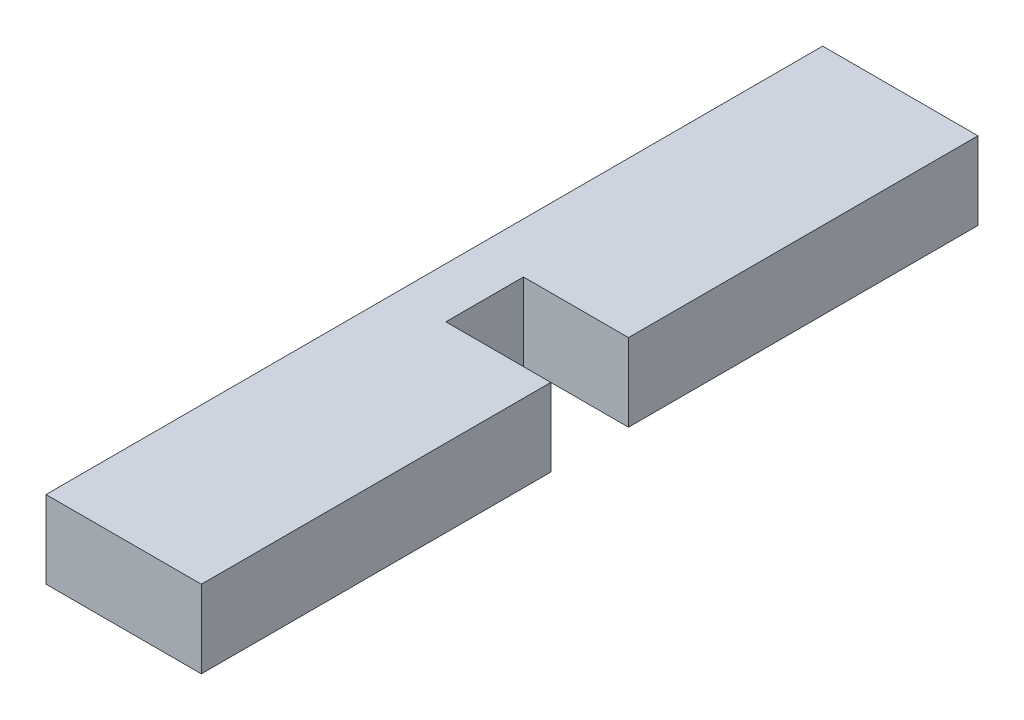
ISO-10303-21;
HEADER;
FILE_DESCRIPTION(('STEP AP214'),'2;1');
FILE_NAME('part.step','',(''),(''),'','','');
FILE_SCHEMA(('AUTOMOTIVE_DESIGN { 1 0 10303 214 1 1 1 1 }'));
ENDSEC;
DATA;
#1=APPLICATION_CONTEXT('core data for automotive mechanical design processes');
#2=APPLICATION_PROTOCOL_DEFINITION('international standard','automotive_design',2000,#1);
#3=PRODUCT_CONTEXT('',#1,'mechanical');
#4=PRODUCT('Part','Part','',(#3));
#5=PRODUCT_RELATED_PRODUCT_CATEGORY('part','',(#4));
#6=PRODUCT_DEFINITION_FORMATION('','',#4);
#7=PRODUCT_DEFINITION_CONTEXT('part definition',#1,'design');
#8=PRODUCT_DEFINITION('design','',#6,#7);
#9=PRODUCT_DEFINITION_SHAPE('','',#8);
#10=(LENGTH_UNIT() NAMED_UNIT(*) SI_UNIT(.MILLI.,.METRE.));
#11=(NAMED_UNIT(*) PLANE_ANGLE_UNIT() SI_UNIT($,.RADIAN.));
#12=(NAMED_UNIT(*) SI_UNIT($,.STERADIAN.) SOLID_ANGLE_UNIT());
#13=UNCERTAINTY_MEASURE_WITH_UNIT(LENGTH_MEASURE(1.E-05),#10,'distance_accuracy_value','');
#14=(GEOMETRIC_REPRESENTATION_CONTEXT(3) GLOBAL_UNCERTAINTY_ASSIGNED_CONTEXT((#13)) GLOBAL_UNIT_ASSIGNED_CONTEXT((#10,
#11,#12)) REPRESENTATION_CONTEXT('',''));
#15=CARTESIAN_POINT('',(0.,0.,0.));
#16=DIRECTION('',(0.,0.,1.));
#17=DIRECTION('',(1.,0.,0.));
#18=AXIS2_PLACEMENT_3D('',#15,#16,#17);
#19=CARTESIAN_POINT('',(5.,5.,-25.));
#20=DIRECTION('',(-1.,0.,0.));
#21=DIRECTION('',(0.,0.,1.));
#22=AXIS2_PLACEMENT_3D('',#19,#20,#21);
#23=PLANE('',#22);
#24=DIRECTION('',(0.,0.,-1.));
#25=VECTOR('',#24,1.);
#26=CARTESIAN_POINT('',(5.,0.,-25.));
#27=LINE('',#26,#25);
#28=CARTESIAN_POINT('',(5.00000000000001,0.,25.));
#29=VERTEX_POINT('',#28);
#30=CARTESIAN_POINT('',(5.00000000000001,0.,2.5));
#31=VERTEX_POINT('',#30);
#32=EDGE_CURVE('E130',#29,#31,#27,.T.);
#33=ORIENTED_EDGE('',*,*,#32,.T.);
#34=DIRECTION('',(0.,1.,0.));
#35=VECTOR('',#34,1.);
#36=CARTESIAN_POINT('',(5.00000000000001,0.,2.5));
#37=LINE('',#36,#35);
#38=CARTESIAN_POINT('',(5.00000000000001,5.,2.5));
#39=VERTEX_POINT('',#38);
#40=EDGE_CURVE('E131',#31,#39,#37,.T.);
#41=ORIENTED_EDGE('',*,*,#40,.T.);
#42=DIRECTION('',(0.,0.,-1.));
#43=VECTOR('',#42,1.);
#44=CARTESIAN_POINT('',(5.,5.,-25.));
#45=LINE('',#44,#43);
#46=CARTESIAN_POINT('',(5.00000000000001,5.,25.));
#47=VERTEX_POINT('',#46);
#48=EDGE_CURVE('E160',#47,#39,#45,.T.);
#49=ORIENTED_EDGE('',*,*,#48,.F.);
#50=DIRECTION('',(0.,-1.,0.));
#51=VECTOR('',#50,1.);
#52=CARTESIAN_POINT('',(5.00000000000001,5.,25.));
#53=LINE('',#52,#51);
#54=EDGE_CURVE('E144',#47,#29,#53,.T.);
#55=ORIENTED_EDGE('',*,*,#54,.T.);
#56=EDGE_LOOP('',(#33,#41,#49,#55));
#57=FACE_BOUND('',#56,.T.);
#58=ADVANCED_FACE('F37',(#57),#23,.F.);
#59=CARTESIAN_POINT('',(5.00000000000001,5.,-2.5));
#60=VERTEX_POINT('',#59);
#61=CARTESIAN_POINT('',(5.,5.,-25.));
#62=VERTEX_POINT('',#61);
#63=EDGE_CURVE('E89',#60,#62,#45,.T.);
#64=ORIENTED_EDGE('',*,*,#63,.F.);
#65=DIRECTION('',(0.,1.,0.));
#66=VECTOR('',#65,1.);
#67=CARTESIAN_POINT('',(5.00000000000001,0.,-2.5));
#68=LINE('',#67,#66);
#69=CARTESIAN_POINT('',(5.00000000000001,0.,-2.5));
#70=VERTEX_POINT('',#69);
#71=EDGE_CURVE('E115',#70,#60,#68,.T.);
#72=ORIENTED_EDGE('',*,*,#71,.F.);
#73=CARTESIAN_POINT('',(5.,0.,-25.));
#74=VERTEX_POINT('',#73);
#75=EDGE_CURVE('E123',#70,#74,#27,.T.);
#76=ORIENTED_EDGE('',*,*,#75,.T.);
#77=DIRECTION('',(0.,-1.,0.));
#78=VECTOR('',#77,1.);
#79=CARTESIAN_POINT('',(5.,5.,-25.));
#80=LINE('',#79,#78);
#81=EDGE_CURVE('E11',#62,#74,#80,.T.);
#82=ORIENTED_EDGE('',*,*,#81,.F.);
#83=EDGE_LOOP('',(#64,#72,#76,#82));
#84=FACE_BOUND('',#83,.T.);
#85=ADVANCED_FACE('F39',(#84),#23,.F.);
#86=CARTESIAN_POINT('',(-5.,5.,-25.));
#87=DIRECTION('',(0.,0.,1.));
#88=DIRECTION('',(1.,0.,0.));
#89=AXIS2_PLACEMENT_3D('',#86,#87,#88);
#90=PLANE('',#89);
#91=DIRECTION('',(-1.,0.,0.));
#92=VECTOR('',#91,1.);
#93=CARTESIAN_POINT('',(-5.,0.,-25.));
#94=LINE('',#93,#92);
#95=CARTESIAN_POINT('',(-5.,0.,-25.));
#96=VERTEX_POINT('',#95);
#97=EDGE_CURVE('E129',#74,#96,#94,.T.);
#98=ORIENTED_EDGE('',*,*,#97,.T.);
#99=DIRECTION('',(0.,-1.,0.));
#100=VECTOR('',#99,1.);
#101=CARTESIAN_POINT('',(-5.,5.,-25.));
#102=LINE('',#101,#100);
#103=CARTESIAN_POINT('',(-5.,5.,-25.));
#104=VERTEX_POINT('',#103);
#105=EDGE_CURVE('E45',#104,#96,#102,.T.);
#106=ORIENTED_EDGE('',*,*,#105,.F.);
#107=DIRECTION('',(-1.,0.,0.));
#108=VECTOR('',#107,1.);
#109=CARTESIAN_POINT('',(-5.,5.,-25.));
#110=LINE('',#109,#108);
#111=EDGE_CURVE('E162',#62,#104,#110,.T.);
#112=ORIENTED_EDGE('',*,*,#111,.F.);
#113=ORIENTED_EDGE('',*,*,#81,.T.);
#114=EDGE_LOOP('',(#98,#106,#112,#113));
#115=FACE_BOUND('',#114,.T.);
#116=ADVANCED_FACE('F193',(#115),#90,.F.);
#117=CARTESIAN_POINT('',(-5.,5.,-25.));
#118=DIRECTION('',(1.,0.,0.));
#119=DIRECTION('',(0.,0.,-1.));
#120=AXIS2_PLACEMENT_3D('',#117,#118,#119);
#121=PLANE('',#120);
#122=DIRECTION('',(0.,0.,1.));
#123=VECTOR('',#122,1.);
#124=CARTESIAN_POINT('',(-5.,0.,-25.));
#125=LINE('',#124,#123);
#126=CARTESIAN_POINT('',(-4.99999999999999,0.,25.));
#127=VERTEX_POINT('',#126);
#128=EDGE_CURVE('E141',#96,#127,#125,.T.);
#129=ORIENTED_EDGE('',*,*,#128,.T.);
#130=DIRECTION('',(0.,-1.,0.));
#131=VECTOR('',#130,1.);
#132=CARTESIAN_POINT('',(-4.99999999999999,5.,25.));
#133=LINE('',#132,#131);
#134=CARTESIAN_POINT('',(-4.99999999999999,5.,25.));
#135=VERTEX_POINT('',#134);
#136=EDGE_CURVE('E146',#135,#127,#133,.T.);
#137=ORIENTED_EDGE('',*,*,#136,.F.);
#138=DIRECTION('',(0.,0.,1.));
#139=VECTOR('',#138,1.);
#140=CARTESIAN_POINT('',(-5.,5.,-25.));
#141=LINE('',#140,#139);
#142=EDGE_CURVE('E153',#104,#135,#141,.T.);
#143=ORIENTED_EDGE('',*,*,#142,.F.);
#144=ORIENTED_EDGE('',*,*,#105,.T.);
#145=EDGE_LOOP('',(#129,#137,#143,#144));
#146=FACE_BOUND('',#145,.T.);
#147=ADVANCED_FACE('F151',(#146),#121,.F.);
#148=CARTESIAN_POINT('',(-4.99999999999999,5.,25.));
#149=DIRECTION('',(0.,0.,-1.));
#150=DIRECTION('',(-1.,0.,0.));
#151=AXIS2_PLACEMENT_3D('',#148,#149,#150);
#152=PLANE('',#151);
#153=DIRECTION('',(1.,0.,0.));
#154=VECTOR('',#153,1.);
#155=CARTESIAN_POINT('',(-4.99999999999999,0.,25.));
#156=LINE('',#155,#154);
#157=EDGE_CURVE('E82',#127,#29,#156,.T.);
#158=ORIENTED_EDGE('',*,*,#157,.T.);
#159=ORIENTED_EDGE('',*,*,#54,.F.);
#160=DIRECTION('',(1.,0.,0.));
#161=VECTOR('',#160,1.);
#162=CARTESIAN_POINT('',(-4.99999999999999,5.,25.));
#163=LINE('',#162,#161);
#164=EDGE_CURVE('E61',#135,#47,#163,.T.);
#165=ORIENTED_EDGE('',*,*,#164,.F.);
#166=ORIENTED_EDGE('',*,*,#136,.T.);
#167=EDGE_LOOP('',(#158,#159,#165,#166));
#168=FACE_BOUND('',#167,.T.);
#169=ADVANCED_FACE('F161',(#168),#152,.F.);
#170=CARTESIAN_POINT('',(0.,5.,0.));
#171=DIRECTION('',(0.,1.,0.));
#172=DIRECTION('',(0.,0.,1.));
#173=AXIS2_PLACEMENT_3D('',#170,#171,#172);
#174=PLANE('',#173);
#175=DIRECTION('',(1.,0.,0.));
#176=VECTOR('',#175,1.);
#177=CARTESIAN_POINT('',(-1.75945401244345,5.,2.5));
#178=LINE('',#177,#176);
#179=CARTESIAN_POINT('',(-1.75945401244345,5.,2.5));
#180=VERTEX_POINT('',#179);
#181=EDGE_CURVE('E119',#180,#39,#178,.T.);
#182=ORIENTED_EDGE('',*,*,#181,.F.);
#183=DIRECTION('',(0.,0.,1.));
#184=VECTOR('',#183,1.);
#185=CARTESIAN_POINT('',(-1.75945401244346,5.,-2.5));
#186=LINE('',#185,#184);
#187=CARTESIAN_POINT('',(-1.75945401244346,5.,-2.5));
#188=VERTEX_POINT('',#187);
#189=EDGE_CURVE('E169',#188,#180,#186,.T.);
#190=ORIENTED_EDGE('',*,*,#189,.F.);
#191=DIRECTION('',(-1.,0.,0.));
#192=VECTOR('',#191,1.);
#193=CARTESIAN_POINT('',(5.00000000000001,5.,-2.5));
#194=LINE('',#193,#192);
#195=EDGE_CURVE('E172',#60,#188,#194,.T.);
#196=ORIENTED_EDGE('',*,*,#195,.F.);
#197=ORIENTED_EDGE('',*,*,#63,.T.);
#198=ORIENTED_EDGE('',*,*,#111,.T.);
#199=ORIENTED_EDGE('',*,*,#142,.T.);
#200=ORIENTED_EDGE('',*,*,#164,.T.);
#201=ORIENTED_EDGE('',*,*,#48,.T.);
#202=EDGE_LOOP('',(#182,#190,#196,#197,#198,#199,#200,#201));
#203=FACE_BOUND('',#202,.T.);
#204=ADVANCED_FACE('F177',(#203),#174,.T.);
#205=CARTESIAN_POINT('',(0.,0.,0.));
#206=DIRECTION('',(0.,1.,0.));
#207=DIRECTION('',(0.,0.,1.));
#208=AXIS2_PLACEMENT_3D('',#205,#206,#207);
#209=PLANE('',#208);
#210=DIRECTION('',(0.,0.,1.));
#211=VECTOR('',#210,1.);
#212=CARTESIAN_POINT('',(-1.75945401244346,0.,-2.5));
#213=LINE('',#212,#211);
#214=CARTESIAN_POINT('',(-1.75945401244346,0.,-2.5));
#215=VERTEX_POINT('',#214);
#216=CARTESIAN_POINT('',(-1.75945401244345,0.,2.5));
#217=VERTEX_POINT('',#216);
#218=EDGE_CURVE('E52',#215,#217,#213,.T.);
#219=ORIENTED_EDGE('',*,*,#218,.T.);
#220=DIRECTION('',(1.,0.,0.));
#221=VECTOR('',#220,1.);
#222=CARTESIAN_POINT('',(-1.75945401244345,0.,2.5));
#223=LINE('',#222,#221);
#224=EDGE_CURVE('E125',#217,#31,#223,.T.);
#225=ORIENTED_EDGE('',*,*,#224,.T.);
#226=ORIENTED_EDGE('',*,*,#32,.F.);
#227=ORIENTED_EDGE('',*,*,#157,.F.);
#228=ORIENTED_EDGE('',*,*,#128,.F.);
#229=ORIENTED_EDGE('',*,*,#97,.F.);
#230=ORIENTED_EDGE('',*,*,#75,.F.);
#231=DIRECTION('',(-1.,0.,0.));
#232=VECTOR('',#231,1.);
#233=CARTESIAN_POINT('',(5.00000000000001,0.,-2.5));
#234=LINE('',#233,#232);
#235=EDGE_CURVE('E111',#70,#215,#234,.T.);
#236=ORIENTED_EDGE('',*,*,#235,.T.);
#237=EDGE_LOOP('',(#219,#225,#226,#227,#228,#229,#230,#236));
#238=FACE_BOUND('',#237,.T.);
#239=ADVANCED_FACE('F127',(#238),#209,.F.);
#240=CARTESIAN_POINT('',(-1.75945401244345,0.,2.5));
#241=DIRECTION('',(0.,0.,1.));
#242=DIRECTION('',(1.,0.,0.));
#243=AXIS2_PLACEMENT_3D('',#240,#241,#242);
#244=PLANE('',#243);
#245=ORIENTED_EDGE('',*,*,#181,.T.);
#246=ORIENTED_EDGE('',*,*,#40,.F.);
#247=ORIENTED_EDGE('',*,*,#224,.F.);
#248=DIRECTION('',(0.,1.,0.));
#249=VECTOR('',#248,1.);
#250=CARTESIAN_POINT('',(-1.75945401244345,0.,2.5));
#251=LINE('',#250,#249);
#252=EDGE_CURVE('E135',#217,#180,#251,.T.);
#253=ORIENTED_EDGE('',*,*,#252,.T.);
#254=EDGE_LOOP('',(#245,#246,#247,#253));
#255=FACE_BOUND('',#254,.T.);
#256=ADVANCED_FACE('F180',(#255),#244,.F.);
#257=CARTESIAN_POINT('',(-1.75945401244346,0.,-2.5));
#258=DIRECTION('',(-1.,0.,0.));
#259=DIRECTION('',(0.,0.,1.));
#260=AXIS2_PLACEMENT_3D('',#257,#258,#259);
#261=PLANE('',#260);
#262=ORIENTED_EDGE('',*,*,#189,.T.);
#263=ORIENTED_EDGE('',*,*,#252,.F.);
#264=ORIENTED_EDGE('',*,*,#218,.F.);
#265=DIRECTION('',(0.,1.,0.));
#266=VECTOR('',#265,1.);
#267=CARTESIAN_POINT('',(-1.75945401244346,0.,-2.5));
#268=LINE('',#267,#266);
#269=EDGE_CURVE('E116',#215,#188,#268,.T.);
#270=ORIENTED_EDGE('',*,*,#269,.T.);
#271=EDGE_LOOP('',(#262,#263,#264,#270));
#272=FACE_BOUND('',#271,.T.);
#273=ADVANCED_FACE('F178',(#272),#261,.F.);
#274=CARTESIAN_POINT('',(5.00000000000001,0.,-2.5));
#275=DIRECTION('',(0.,0.,-1.));
#276=DIRECTION('',(-1.,0.,0.));
#277=AXIS2_PLACEMENT_3D('',#274,#275,#276);
#278=PLANE('',#277);
#279=ORIENTED_EDGE('',*,*,#195,.T.);
#280=ORIENTED_EDGE('',*,*,#269,.F.);
#281=ORIENTED_EDGE('',*,*,#235,.F.);
#282=ORIENTED_EDGE('',*,*,#71,.T.);
#283=EDGE_LOOP('',(#279,#280,#281,#282));
#284=FACE_BOUND('',#283,.T.);
#285=ADVANCED_FACE('F114',(#284),#278,.F.);
#286=CLOSED_SHELL('',(#58,#85,#116,#147,#169,#204,#239,#256,#273,#285));
#287=MANIFOLD_SOLID_BREP('B2',#286);
#288=ADVANCED_BREP_SHAPE_REPRESENTATION('',(#18,#287),#14);
#289=SHAPE_DEFINITION_REPRESENTATION(#9,#288);
ENDSEC;
END-ISO-10303-21;
